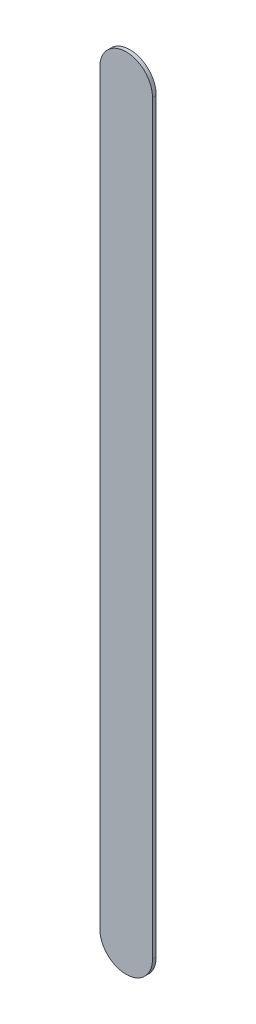
ISO-10303-21;
HEADER;
FILE_DESCRIPTION(('STEP AP214'),'2;1');
FILE_NAME('part.step','',(''),(''),'','','');
FILE_SCHEMA(('AUTOMOTIVE_DESIGN { 1 0 10303 214 1 1 1 1 }'));
ENDSEC;
DATA;
#1=APPLICATION_CONTEXT('core data for automotive mechanical design processes');
#2=APPLICATION_PROTOCOL_DEFINITION('international standard','automotive_design',2000,#1);
#3=PRODUCT_CONTEXT('',#1,'mechanical');
#4=PRODUCT('Part','Part','',(#3));
#5=PRODUCT_RELATED_PRODUCT_CATEGORY('part','',(#4));
#6=PRODUCT_DEFINITION_FORMATION('','',#4);
#7=PRODUCT_DEFINITION_CONTEXT('part definition',#1,'design');
#8=PRODUCT_DEFINITION('design','',#6,#7);
#9=PRODUCT_DEFINITION_SHAPE('','',#8);
#10=(LENGTH_UNIT() NAMED_UNIT(*) SI_UNIT(.MILLI.,.METRE.));
#11=(NAMED_UNIT(*) PLANE_ANGLE_UNIT() SI_UNIT($,.RADIAN.));
#12=(NAMED_UNIT(*) SI_UNIT($,.STERADIAN.) SOLID_ANGLE_UNIT());
#13=UNCERTAINTY_MEASURE_WITH_UNIT(LENGTH_MEASURE(1.E-05),#10,'distance_accuracy_value','');
#14=(GEOMETRIC_REPRESENTATION_CONTEXT(3) GLOBAL_UNCERTAINTY_ASSIGNED_CONTEXT((#13)) GLOBAL_UNIT_ASSIGNED_CONTEXT((#10,
#11,#12)) REPRESENTATION_CONTEXT('',''));
#15=CARTESIAN_POINT('',(0.,0.,0.));
#16=DIRECTION('',(0.,0.,1.));
#17=DIRECTION('',(1.,0.,0.));
#18=AXIS2_PLACEMENT_3D('',#15,#16,#17);
#19=CARTESIAN_POINT('',(37.13771338,96.40771422,0.));
#20=DIRECTION('',(-1.,0.,0.));
#21=DIRECTION('',(0.,1.,0.));
#22=AXIS2_PLACEMENT_3D('',#19,#20,#21);
#23=PLANE('',#22);
#24=DIRECTION('',(0.,1.,0.));
#25=VECTOR('',#24,1.);
#26=CARTESIAN_POINT('',(37.13771338,96.40771422,0.03556));
#27=LINE('',#26,#25);
#28=CARTESIAN_POINT('',(37.13771338,96.40771422,0.03556));
#29=VERTEX_POINT('',#28);
#30=CARTESIAN_POINT('',(37.13771338,103.4877153,0.03556));
#31=VERTEX_POINT('',#30);
#32=EDGE_CURVE('E11',#29,#31,#27,.T.);
#33=ORIENTED_EDGE('',*,*,#32,.F.);
#34=DIRECTION('',(0.,0.,1.));
#35=VECTOR('',#34,1.);
#36=CARTESIAN_POINT('',(37.13771338,96.40771422,0.));
#37=LINE('',#36,#35);
#38=CARTESIAN_POINT('',(37.13771338,96.40771422,0.));
#39=VERTEX_POINT('',#38);
#40=EDGE_CURVE('E24',#39,#29,#37,.T.);
#41=ORIENTED_EDGE('',*,*,#40,.F.);
#42=DIRECTION('',(0.,1.,0.));
#43=VECTOR('',#42,1.);
#44=CARTESIAN_POINT('',(37.13771338,96.40771422,0.));
#45=LINE('',#44,#43);
#46=CARTESIAN_POINT('',(37.13771338,103.4877153,0.));
#47=VERTEX_POINT('',#46);
#48=EDGE_CURVE('E75',#39,#47,#45,.T.);
#49=ORIENTED_EDGE('',*,*,#48,.T.);
#50=DIRECTION('',(0.,0.,1.));
#51=VECTOR('',#50,1.);
#52=CARTESIAN_POINT('',(37.13771338,103.4877153,0.));
#53=LINE('',#52,#51);
#54=EDGE_CURVE('E37',#47,#31,#53,.T.);
#55=ORIENTED_EDGE('',*,*,#54,.T.);
#56=EDGE_LOOP('',(#33,#41,#49,#55));
#57=FACE_BOUND('',#56,.T.);
#58=ADVANCED_FACE('F17',(#57),#23,.F.);
#59=CARTESIAN_POINT('',(36.88771388,103.4877153,0.));
#60=DIRECTION('',(0.,0.,-1.));
#61=DIRECTION('',(1.,0.,0.));
#62=AXIS2_PLACEMENT_3D('',#59,#60,#61);
#63=CYLINDRICAL_SURFACE('',#62,0.249999500000001);
#64=CARTESIAN_POINT('',(36.88771388,103.4877153,0.03556));
#65=DIRECTION('',(0.,0.,1.));
#66=DIRECTION('',(1.,0.,0.));
#67=AXIS2_PLACEMENT_3D('',#64,#65,#66);
#68=CIRCLE('',#67,0.249999500000001);
#69=CARTESIAN_POINT('',(36.63771438,103.4877153,0.03556));
#70=VERTEX_POINT('',#69);
#71=EDGE_CURVE('E83',#31,#70,#68,.T.);
#72=ORIENTED_EDGE('',*,*,#71,.F.);
#73=ORIENTED_EDGE('',*,*,#54,.F.);
#74=CARTESIAN_POINT('',(36.88771388,103.4877153,0.));
#75=DIRECTION('',(0.,0.,1.));
#76=DIRECTION('',(1.,0.,0.));
#77=AXIS2_PLACEMENT_3D('',#74,#75,#76);
#78=CIRCLE('',#77,0.249999500000001);
#79=CARTESIAN_POINT('',(36.63771438,103.4877153,0.));
#80=VERTEX_POINT('',#79);
#81=EDGE_CURVE('E81',#47,#80,#78,.T.);
#82=ORIENTED_EDGE('',*,*,#81,.T.);
#83=DIRECTION('',(0.,0.,1.));
#84=VECTOR('',#83,1.);
#85=CARTESIAN_POINT('',(36.63771438,103.4877153,0.));
#86=LINE('',#85,#84);
#87=EDGE_CURVE('E67',#80,#70,#86,.T.);
#88=ORIENTED_EDGE('',*,*,#87,.T.);
#89=EDGE_LOOP('',(#72,#73,#82,#88));
#90=FACE_BOUND('',#89,.T.);
#91=ADVANCED_FACE('F89',(#90),#63,.T.);
#92=CARTESIAN_POINT('',(36.63771438,103.4877153,0.));
#93=DIRECTION('',(1.,0.,0.));
#94=DIRECTION('',(0.,-1.,0.));
#95=AXIS2_PLACEMENT_3D('',#92,#93,#94);
#96=PLANE('',#95);
#97=DIRECTION('',(0.,-1.,0.));
#98=VECTOR('',#97,1.);
#99=CARTESIAN_POINT('',(36.63771438,103.4877153,0.03556));
#100=LINE('',#99,#98);
#101=CARTESIAN_POINT('',(36.63771438,96.40771422,0.03556));
#102=VERTEX_POINT('',#101);
#103=EDGE_CURVE('E71',#70,#102,#100,.T.);
#104=ORIENTED_EDGE('',*,*,#103,.F.);
#105=ORIENTED_EDGE('',*,*,#87,.F.);
#106=DIRECTION('',(0.,-1.,0.));
#107=VECTOR('',#106,1.);
#108=CARTESIAN_POINT('',(36.63771438,103.4877153,0.));
#109=LINE('',#108,#107);
#110=CARTESIAN_POINT('',(36.63771438,96.40771422,0.));
#111=VERTEX_POINT('',#110);
#112=EDGE_CURVE('E63',#80,#111,#109,.T.);
#113=ORIENTED_EDGE('',*,*,#112,.T.);
#114=DIRECTION('',(0.,0.,1.));
#115=VECTOR('',#114,1.);
#116=CARTESIAN_POINT('',(36.63771438,96.40771422,0.));
#117=LINE('',#116,#115);
#118=EDGE_CURVE('E53',#111,#102,#117,.T.);
#119=ORIENTED_EDGE('',*,*,#118,.T.);
#120=EDGE_LOOP('',(#104,#105,#113,#119));
#121=FACE_BOUND('',#120,.T.);
#122=ADVANCED_FACE('F66',(#121),#96,.F.);
#123=CARTESIAN_POINT('',(36.88771388,96.40771422,0.));
#124=DIRECTION('',(0.,0.,-1.));
#125=DIRECTION('',(-1.,0.,0.));
#126=AXIS2_PLACEMENT_3D('',#123,#124,#125);
#127=CYLINDRICAL_SURFACE('',#126,0.249999500000001);
#128=CARTESIAN_POINT('',(36.88771388,96.40771422,0.03556));
#129=DIRECTION('',(0.,0.,1.));
#130=DIRECTION('',(-1.,0.,0.));
#131=AXIS2_PLACEMENT_3D('',#128,#129,#130);
#132=CIRCLE('',#131,0.249999500000001);
#133=EDGE_CURVE('E59',#102,#29,#132,.T.);
#134=ORIENTED_EDGE('',*,*,#133,.F.);
#135=ORIENTED_EDGE('',*,*,#118,.F.);
#136=CARTESIAN_POINT('',(36.88771388,96.40771422,0.));
#137=DIRECTION('',(0.,0.,1.));
#138=DIRECTION('',(-1.,0.,0.));
#139=AXIS2_PLACEMENT_3D('',#136,#137,#138);
#140=CIRCLE('',#139,0.249999500000001);
#141=EDGE_CURVE('E57',#111,#39,#140,.T.);
#142=ORIENTED_EDGE('',*,*,#141,.T.);
#143=ORIENTED_EDGE('',*,*,#40,.T.);
#144=EDGE_LOOP('',(#134,#135,#142,#143));
#145=FACE_BOUND('',#144,.T.);
#146=ADVANCED_FACE('F55',(#145),#127,.T.);
#147=CARTESIAN_POINT('',(37.13771338,96.40771422,0.));
#148=DIRECTION('',(0.,0.,-1.));
#149=DIRECTION('',(-1.,0.,0.));
#150=AXIS2_PLACEMENT_3D('',#147,#148,#149);
#151=PLANE('',#150);
#152=ORIENTED_EDGE('',*,*,#141,.F.);
#153=ORIENTED_EDGE('',*,*,#112,.F.);
#154=ORIENTED_EDGE('',*,*,#81,.F.);
#155=ORIENTED_EDGE('',*,*,#48,.F.);
#156=EDGE_LOOP('',(#152,#153,#154,#155));
#157=FACE_BOUND('',#156,.T.);
#158=ADVANCED_FACE('F74',(#157),#151,.T.);
#159=CARTESIAN_POINT('',(37.13771338,96.40771422,0.03556));
#160=DIRECTION('',(0.,0.,-1.));
#161=DIRECTION('',(-1.,0.,0.));
#162=AXIS2_PLACEMENT_3D('',#159,#160,#161);
#163=PLANE('',#162);
#164=ORIENTED_EDGE('',*,*,#32,.T.);
#165=ORIENTED_EDGE('',*,*,#71,.T.);
#166=ORIENTED_EDGE('',*,*,#103,.T.);
#167=ORIENTED_EDGE('',*,*,#133,.T.);
#168=EDGE_LOOP('',(#164,#165,#166,#167));
#169=FACE_BOUND('',#168,.T.);
#170=ADVANCED_FACE('F91',(#169),#163,.F.);
#171=CLOSED_SHELL('',(#58,#91,#122,#146,#158,#170));
#172=MANIFOLD_SOLID_BREP('B1',#171);
#173=ADVANCED_BREP_SHAPE_REPRESENTATION('',(#18,#172),#14);
#174=SHAPE_DEFINITION_REPRESENTATION(#9,#173);
ENDSEC;
END-ISO-10303-21;
